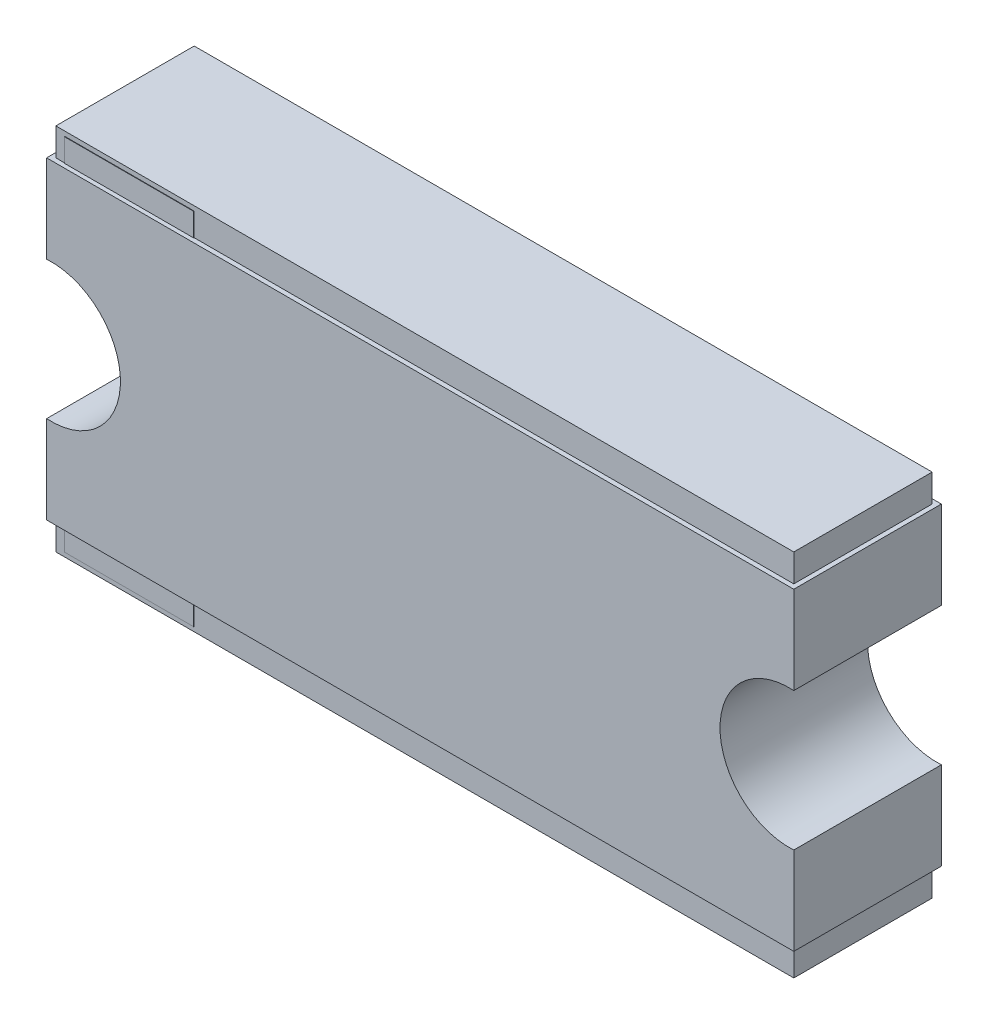
ISO-10303-21;
HEADER;
FILE_DESCRIPTION(('STEP AP214'),'2;1');
FILE_NAME('part.step','',(''),(''),'','','');
FILE_SCHEMA(('AUTOMOTIVE_DESIGN { 1 0 10303 214 1 1 1 1 }'));
ENDSEC;
DATA;
#1=APPLICATION_CONTEXT('core data for automotive mechanical design processes');
#2=APPLICATION_PROTOCOL_DEFINITION('international standard','automotive_design',2000,#1);
#3=PRODUCT_CONTEXT('',#1,'mechanical');
#4=PRODUCT('Part','Part','',(#3));
#5=PRODUCT_RELATED_PRODUCT_CATEGORY('part','',(#4));
#6=PRODUCT_DEFINITION_FORMATION('','',#4);
#7=PRODUCT_DEFINITION_CONTEXT('part definition',#1,'design');
#8=PRODUCT_DEFINITION('design','',#6,#7);
#9=PRODUCT_DEFINITION_SHAPE('','',#8);
#10=(LENGTH_UNIT() NAMED_UNIT(*) SI_UNIT(.MILLI.,.METRE.));
#11=(NAMED_UNIT(*) PLANE_ANGLE_UNIT() SI_UNIT($,.RADIAN.));
#12=(NAMED_UNIT(*) SI_UNIT($,.STERADIAN.) SOLID_ANGLE_UNIT());
#13=UNCERTAINTY_MEASURE_WITH_UNIT(LENGTH_MEASURE(1.E-05),#10,'distance_accuracy_value','');
#14=(GEOMETRIC_REPRESENTATION_CONTEXT(3) GLOBAL_UNCERTAINTY_ASSIGNED_CONTEXT((#13)) GLOBAL_UNIT_ASSIGNED_CONTEXT((#10,
#11,#12)) REPRESENTATION_CONTEXT('',''));
#15=CARTESIAN_POINT('',(0.,0.,0.));
#16=DIRECTION('',(0.,0.,1.));
#17=DIRECTION('',(1.,0.,0.));
#18=AXIS2_PLACEMENT_3D('',#15,#16,#17);
#19=CARTESIAN_POINT('',(0.,0.,0.));
#20=DIRECTION('',(0.,0.,-1.));
#21=DIRECTION('',(-1.,0.,0.));
#22=AXIS2_PLACEMENT_3D('',#19,#20,#21);
#23=PLANE('',#22);
#24=DIRECTION('',(0.,-1.,0.));
#25=VECTOR('',#24,1.);
#26=CARTESIAN_POINT('',(0.475,0.375,0.));
#27=LINE('',#26,#25);
#28=CARTESIAN_POINT('',(0.475,0.375,0.));
#29=VERTEX_POINT('',#28);
#30=CARTESIAN_POINT('',(0.475,-0.375,0.));
#31=VERTEX_POINT('',#30);
#32=EDGE_CURVE('E337',#29,#31,#27,.T.);
#33=ORIENTED_EDGE('',*,*,#32,.T.);
#34=DIRECTION('',(1.,0.,0.));
#35=VECTOR('',#34,1.);
#36=CARTESIAN_POINT('',(0.475,-0.375,0.));
#37=LINE('',#36,#35);
#38=CARTESIAN_POINT('',(-0.475,-0.375,0.));
#39=VERTEX_POINT('',#38);
#40=EDGE_CURVE('E330',#31,#39,#37,.F.);
#41=ORIENTED_EDGE('',*,*,#40,.T.);
#42=DIRECTION('',(0.,1.,0.));
#43=VECTOR('',#42,1.);
#44=CARTESIAN_POINT('',(-0.475,0.375,0.));
#45=LINE('',#44,#43);
#46=CARTESIAN_POINT('',(-0.475,0.375,0.));
#47=VERTEX_POINT('',#46);
#48=EDGE_CURVE('E323',#39,#47,#45,.T.);
#49=ORIENTED_EDGE('',*,*,#48,.T.);
#50=DIRECTION('',(1.,0.,0.));
#51=VECTOR('',#50,1.);
#52=CARTESIAN_POINT('',(0.475,0.375,0.));
#53=LINE('',#52,#51);
#54=EDGE_CURVE('E343',#47,#29,#53,.T.);
#55=ORIENTED_EDGE('',*,*,#54,.T.);
#56=EDGE_LOOP('',(#33,#41,#49,#55));
#57=FACE_BOUND('',#56,.T.);
#58=ADVANCED_FACE('F17',(#57),#23,.T.);
#59=CARTESIAN_POINT('',(0.475,0.375,0.));
#60=DIRECTION('',(0.,-1.,0.));
#61=DIRECTION('',(0.,0.,-1.));
#62=AXIS2_PLACEMENT_3D('',#59,#60,#61);
#63=PLANE('',#62);
#64=DIRECTION('',(0.,0.,1.));
#65=VECTOR('',#64,1.);
#66=CARTESIAN_POINT('',(0.475,0.375,0.));
#67=LINE('',#66,#65);
#68=CARTESIAN_POINT('',(0.475,0.375,0.01));
#69=VERTEX_POINT('',#68);
#70=EDGE_CURVE('E340',#69,#29,#67,.F.);
#71=ORIENTED_EDGE('',*,*,#70,.T.);
#72=ORIENTED_EDGE('',*,*,#54,.F.);
#73=DIRECTION('',(0.,0.,1.));
#74=VECTOR('',#73,1.);
#75=CARTESIAN_POINT('',(-0.475,0.375,0.));
#76=LINE('',#75,#74);
#77=CARTESIAN_POINT('',(-0.475,0.375,0.01));
#78=VERTEX_POINT('',#77);
#79=EDGE_CURVE('E313',#47,#78,#76,.T.);
#80=ORIENTED_EDGE('',*,*,#79,.T.);
#81=DIRECTION('',(1.,0.,0.));
#82=VECTOR('',#81,1.);
#83=CARTESIAN_POINT('',(0.8,0.375,0.01));
#84=LINE('',#83,#82);
#85=EDGE_CURVE('E287',#78,#69,#84,.T.);
#86=ORIENTED_EDGE('',*,*,#85,.T.);
#87=EDGE_LOOP('',(#71,#72,#80,#86));
#88=FACE_BOUND('',#87,.T.);
#89=ADVANCED_FACE('F1043',(#88),#63,.F.);
#90=CARTESIAN_POINT('',(0.475,0.375,0.));
#91=DIRECTION('',(-1.,0.,0.));
#92=DIRECTION('',(0.,-1.,0.));
#93=AXIS2_PLACEMENT_3D('',#90,#91,#92);
#94=PLANE('',#93);
#95=DIRECTION('',(0.,0.,1.));
#96=VECTOR('',#95,1.);
#97=CARTESIAN_POINT('',(0.475,-0.375,0.));
#98=LINE('',#97,#96);
#99=CARTESIAN_POINT('',(0.475,-0.375,0.01));
#100=VERTEX_POINT('',#99);
#101=EDGE_CURVE('E333',#100,#31,#98,.F.);
#102=ORIENTED_EDGE('',*,*,#101,.T.);
#103=ORIENTED_EDGE('',*,*,#32,.F.);
#104=ORIENTED_EDGE('',*,*,#70,.F.);
#105=DIRECTION('',(0.,1.,0.));
#106=VECTOR('',#105,1.);
#107=CARTESIAN_POINT('',(0.475,-0.4,0.01));
#108=LINE('',#107,#106);
#109=EDGE_CURVE('E284',#69,#100,#108,.F.);
#110=ORIENTED_EDGE('',*,*,#109,.T.);
#111=EDGE_LOOP('',(#102,#103,#104,#110));
#112=FACE_BOUND('',#111,.T.);
#113=ADVANCED_FACE('F1033',(#112),#94,.F.);
#114=CARTESIAN_POINT('',(0.475,-0.375,0.));
#115=DIRECTION('',(0.,1.,0.));
#116=DIRECTION('',(0.,0.,1.));
#117=AXIS2_PLACEMENT_3D('',#114,#115,#116);
#118=PLANE('',#117);
#119=DIRECTION('',(0.,0.,1.));
#120=VECTOR('',#119,1.);
#121=CARTESIAN_POINT('',(-0.475,-0.375,0.));
#122=LINE('',#121,#120);
#123=CARTESIAN_POINT('',(-0.475,-0.375,0.01));
#124=VERTEX_POINT('',#123);
#125=EDGE_CURVE('E326',#124,#39,#122,.F.);
#126=ORIENTED_EDGE('',*,*,#125,.T.);
#127=ORIENTED_EDGE('',*,*,#40,.F.);
#128=ORIENTED_EDGE('',*,*,#101,.F.);
#129=DIRECTION('',(1.,0.,0.));
#130=VECTOR('',#129,1.);
#131=CARTESIAN_POINT('',(0.8,-0.375,0.01));
#132=LINE('',#131,#130);
#133=EDGE_CURVE('E281',#100,#124,#132,.F.);
#134=ORIENTED_EDGE('',*,*,#133,.T.);
#135=EDGE_LOOP('',(#126,#127,#128,#134));
#136=FACE_BOUND('',#135,.T.);
#137=ADVANCED_FACE('F1024',(#136),#118,.F.);
#138=CARTESIAN_POINT('',(-0.475,0.375,0.));
#139=DIRECTION('',(1.,0.,0.));
#140=DIRECTION('',(0.,1.,0.));
#141=AXIS2_PLACEMENT_3D('',#138,#139,#140);
#142=PLANE('',#141);
#143=ORIENTED_EDGE('',*,*,#79,.F.);
#144=ORIENTED_EDGE('',*,*,#48,.F.);
#145=ORIENTED_EDGE('',*,*,#125,.F.);
#146=DIRECTION('',(0.,1.,0.));
#147=VECTOR('',#146,1.);
#148=CARTESIAN_POINT('',(-0.475,-0.4,0.01));
#149=LINE('',#148,#147);
#150=EDGE_CURVE('E276',#124,#78,#149,.T.);
#151=ORIENTED_EDGE('',*,*,#150,.T.);
#152=EDGE_LOOP('',(#143,#144,#145,#151));
#153=FACE_BOUND('',#152,.T.);
#154=ADVANCED_FACE('F1014',(#153),#142,.F.);
#155=CARTESIAN_POINT('',(0.8,-0.4,0.01));
#156=DIRECTION('',(0.,0.,1.));
#157=DIRECTION('',(1.,0.,0.));
#158=AXIS2_PLACEMENT_3D('',#155,#156,#157);
#159=PLANE('',#158);
#160=ORIENTED_EDGE('',*,*,#133,.F.);
#161=ORIENTED_EDGE('',*,*,#109,.F.);
#162=ORIENTED_EDGE('',*,*,#85,.F.);
#163=ORIENTED_EDGE('',*,*,#150,.F.);
#164=EDGE_LOOP('',(#160,#161,#162,#163));
#165=FACE_BOUND('',#164,.T.);
#166=DIRECTION('',(1.,0.,0.));
#167=VECTOR('',#166,1.);
#168=CARTESIAN_POINT('',(0.8,-0.34,0.01));
#169=LINE('',#168,#167);
#170=CARTESIAN_POINT('',(-0.5,-0.34,0.01));
#171=VERTEX_POINT('',#170);
#172=CARTESIAN_POINT('',(-0.8,-0.34,0.01));
#173=VERTEX_POINT('',#172);
#174=EDGE_CURVE('E318',#171,#173,#169,.F.);
#175=ORIENTED_EDGE('',*,*,#174,.F.);
#176=DIRECTION('',(0.,1.,0.));
#177=VECTOR('',#176,1.);
#178=CARTESIAN_POINT('',(-0.5,-0.4,0.01));
#179=LINE('',#178,#177);
#180=CARTESIAN_POINT('',(-0.5,0.34,0.01));
#181=VERTEX_POINT('',#180);
#182=EDGE_CURVE('E348',#181,#171,#179,.F.);
#183=ORIENTED_EDGE('',*,*,#182,.F.);
#184=DIRECTION('',(1.,0.,0.));
#185=VECTOR('',#184,1.);
#186=CARTESIAN_POINT('',(0.8,0.34,0.01));
#187=LINE('',#186,#185);
#188=CARTESIAN_POINT('',(-0.8,0.34,0.01));
#189=VERTEX_POINT('',#188);
#190=EDGE_CURVE('E294',#189,#181,#187,.T.);
#191=ORIENTED_EDGE('',*,*,#190,.F.);
#192=DIRECTION('',(0.,1.,0.));
#193=VECTOR('',#192,1.);
#194=CARTESIAN_POINT('',(-0.8,-0.4,0.01));
#195=LINE('',#194,#193);
#196=CARTESIAN_POINT('',(-0.8,0.4,0.01));
#197=VERTEX_POINT('',#196);
#198=EDGE_CURVE('E291',#197,#189,#195,.F.);
#199=ORIENTED_EDGE('',*,*,#198,.F.);
#200=DIRECTION('',(1.,0.,0.));
#201=VECTOR('',#200,1.);
#202=CARTESIAN_POINT('',(-0.8,0.4,0.01));
#203=LINE('',#202,#201);
#204=CARTESIAN_POINT('',(0.8,0.4,0.01));
#205=VERTEX_POINT('',#204);
#206=EDGE_CURVE('E235',#197,#205,#203,.T.);
#207=ORIENTED_EDGE('',*,*,#206,.T.);
#208=DIRECTION('',(0.,1.,0.));
#209=VECTOR('',#208,1.);
#210=CARTESIAN_POINT('',(0.8,-0.4,0.01));
#211=LINE('',#210,#209);
#212=CARTESIAN_POINT('',(0.8,0.34,0.01));
#213=VERTEX_POINT('',#212);
#214=EDGE_CURVE('E295',#213,#205,#211,.T.);
#215=ORIENTED_EDGE('',*,*,#214,.F.);
#216=DIRECTION('',(1.,0.,0.));
#217=VECTOR('',#216,1.);
#218=CARTESIAN_POINT('',(0.8,0.34,0.01));
#219=LINE('',#218,#217);
#220=CARTESIAN_POINT('',(0.5,0.34,0.01));
#221=VERTEX_POINT('',#220);
#222=EDGE_CURVE('E306',#221,#213,#219,.T.);
#223=ORIENTED_EDGE('',*,*,#222,.F.);
#224=DIRECTION('',(0.,1.,0.));
#225=VECTOR('',#224,1.);
#226=CARTESIAN_POINT('',(0.5,-0.4,0.01));
#227=LINE('',#226,#225);
#228=CARTESIAN_POINT('',(0.5,-0.34,0.01));
#229=VERTEX_POINT('',#228);
#230=EDGE_CURVE('E361',#229,#221,#227,.T.);
#231=ORIENTED_EDGE('',*,*,#230,.F.);
#232=DIRECTION('',(1.,0.,0.));
#233=VECTOR('',#232,1.);
#234=CARTESIAN_POINT('',(0.8,-0.34,0.01));
#235=LINE('',#234,#233);
#236=CARTESIAN_POINT('',(0.8,-0.34,0.01));
#237=VERTEX_POINT('',#236);
#238=EDGE_CURVE('E312',#237,#229,#235,.F.);
#239=ORIENTED_EDGE('',*,*,#238,.F.);
#240=DIRECTION('',(0.,1.,0.));
#241=VECTOR('',#240,1.);
#242=CARTESIAN_POINT('',(0.8,-0.4,0.01));
#243=LINE('',#242,#241);
#244=CARTESIAN_POINT('',(0.8,-0.4,0.01));
#245=VERTEX_POINT('',#244);
#246=EDGE_CURVE('E309',#245,#237,#243,.T.);
#247=ORIENTED_EDGE('',*,*,#246,.F.);
#248=DIRECTION('',(1.,0.,0.));
#249=VECTOR('',#248,1.);
#250=CARTESIAN_POINT('',(-0.8,-0.4,0.01));
#251=LINE('',#250,#249);
#252=CARTESIAN_POINT('',(-0.8,-0.4,0.01));
#253=VERTEX_POINT('',#252);
#254=EDGE_CURVE('E271',#245,#253,#251,.F.);
#255=ORIENTED_EDGE('',*,*,#254,.T.);
#256=DIRECTION('',(0.,1.,0.));
#257=VECTOR('',#256,1.);
#258=CARTESIAN_POINT('',(-0.8,-0.4,0.01));
#259=LINE('',#258,#257);
#260=EDGE_CURVE('E290',#173,#253,#259,.F.);
#261=ORIENTED_EDGE('',*,*,#260,.F.);
#262=EDGE_LOOP('',(#175,#183,#191,#199,#207,#215,#223,#231,#239,#247,#255,#261));
#263=FACE_BOUND('',#262,.T.);
#264=ADVANCED_FACE('F644',(#165,#263),#159,.F.);
#265=CARTESIAN_POINT('',(-0.8,-0.4,0.31));
#266=DIRECTION('',(0.,1.,0.));
#267=DIRECTION('',(0.,0.,1.));
#268=AXIS2_PLACEMENT_3D('',#265,#266,#267);
#269=PLANE('',#268);
#270=DIRECTION('',(0.,0.,1.));
#271=VECTOR('',#270,1.);
#272=CARTESIAN_POINT('',(-0.8,-0.4,0.31));
#273=LINE('',#272,#271);
#274=CARTESIAN_POINT('',(-0.8,-0.4,0.31));
#275=VERTEX_POINT('',#274);
#276=EDGE_CURVE('E250',#253,#275,#273,.T.);
#277=ORIENTED_EDGE('',*,*,#276,.F.);
#278=ORIENTED_EDGE('',*,*,#254,.F.);
#279=DIRECTION('',(0.,0.,1.));
#280=VECTOR('',#279,1.);
#281=CARTESIAN_POINT('',(0.8,-0.4,0.));
#282=LINE('',#281,#280);
#283=CARTESIAN_POINT('',(0.8,-0.4,0.31));
#284=VERTEX_POINT('',#283);
#285=EDGE_CURVE('E255',#245,#284,#282,.T.);
#286=ORIENTED_EDGE('',*,*,#285,.T.);
#287=DIRECTION('',(1.,0.,0.));
#288=VECTOR('',#287,1.);
#289=CARTESIAN_POINT('',(0.8,-0.4,0.31));
#290=LINE('',#289,#288);
#291=EDGE_CURVE('E429',#275,#284,#290,.T.);
#292=ORIENTED_EDGE('',*,*,#291,.F.);
#293=EDGE_LOOP('',(#277,#278,#286,#292));
#294=FACE_BOUND('',#293,.T.);
#295=ADVANCED_FACE('F700',(#294),#269,.F.);
#296=CARTESIAN_POINT('',(-0.5,-0.39,0.311));
#297=DIRECTION('',(0.,1.,0.));
#298=DIRECTION('',(0.,0.,1.));
#299=AXIS2_PLACEMENT_3D('',#296,#297,#298);
#300=PLANE('',#299);
#301=DIRECTION('',(0.,0.,1.));
#302=VECTOR('',#301,1.);
#303=CARTESIAN_POINT('',(-0.5,-0.39,0.311));
#304=LINE('',#303,#302);
#305=CARTESIAN_POINT('',(-0.5,-0.39,0.31));
#306=VERTEX_POINT('',#305);
#307=CARTESIAN_POINT('',(-0.5,-0.39,0.311));
#308=VERTEX_POINT('',#307);
#309=EDGE_CURVE('E230',#306,#308,#304,.T.);
#310=ORIENTED_EDGE('',*,*,#309,.T.);
#311=DIRECTION('',(-1.,0.,0.));
#312=VECTOR('',#311,1.);
#313=CARTESIAN_POINT('',(0.,-0.39,0.311));
#314=LINE('',#313,#312);
#315=CARTESIAN_POINT('',(-0.78,-0.39,0.311));
#316=VERTEX_POINT('',#315);
#317=EDGE_CURVE('E224',#308,#316,#314,.T.);
#318=ORIENTED_EDGE('',*,*,#317,.T.);
#319=DIRECTION('',(0.,0.,1.));
#320=VECTOR('',#319,1.);
#321=CARTESIAN_POINT('',(-0.78,-0.39,0.311));
#322=LINE('',#321,#320);
#323=CARTESIAN_POINT('',(-0.78,-0.39,0.31));
#324=VERTEX_POINT('',#323);
#325=EDGE_CURVE('E20',#316,#324,#322,.F.);
#326=ORIENTED_EDGE('',*,*,#325,.T.);
#327=DIRECTION('',(1.,0.,0.));
#328=VECTOR('',#327,1.);
#329=CARTESIAN_POINT('',(0.8,-0.39,0.31));
#330=LINE('',#329,#328);
#331=EDGE_CURVE('E263',#306,#324,#330,.F.);
#332=ORIENTED_EDGE('',*,*,#331,.F.);
#333=EDGE_LOOP('',(#310,#318,#326,#332));
#334=FACE_BOUND('',#333,.T.);
#335=ADVANCED_FACE('F226',(#334),#300,.F.);
#336=CARTESIAN_POINT('',(-0.8,0.4,0.31));
#337=DIRECTION('',(0.,-1.,0.));
#338=DIRECTION('',(0.,0.,-1.));
#339=AXIS2_PLACEMENT_3D('',#336,#337,#338);
#340=PLANE('',#339);
#341=DIRECTION('',(0.,0.,-1.));
#342=VECTOR('',#341,1.);
#343=CARTESIAN_POINT('',(-0.8,0.4,0.31));
#344=LINE('',#343,#342);
#345=CARTESIAN_POINT('',(-0.8,0.4,0.31));
#346=VERTEX_POINT('',#345);
#347=EDGE_CURVE('E301',#346,#197,#344,.T.);
#348=ORIENTED_EDGE('',*,*,#347,.F.);
#349=DIRECTION('',(1.,0.,0.));
#350=VECTOR('',#349,1.);
#351=CARTESIAN_POINT('',(0.8,0.4,0.31));
#352=LINE('',#351,#350);
#353=CARTESIAN_POINT('',(0.8,0.4,0.31));
#354=VERTEX_POINT('',#353);
#355=EDGE_CURVE('E496',#354,#346,#352,.F.);
#356=ORIENTED_EDGE('',*,*,#355,.F.);
#357=DIRECTION('',(0.,0.,-1.));
#358=VECTOR('',#357,1.);
#359=CARTESIAN_POINT('',(0.8,0.4,0.31));
#360=LINE('',#359,#358);
#361=EDGE_CURVE('E275',#205,#354,#360,.F.);
#362=ORIENTED_EDGE('',*,*,#361,.F.);
#363=ORIENTED_EDGE('',*,*,#206,.F.);
#364=EDGE_LOOP('',(#348,#356,#362,#363));
#365=FACE_BOUND('',#364,.T.);
#366=ADVANCED_FACE('F979',(#365),#340,.F.);
#367=CARTESIAN_POINT('',(-0.78,0.39,0.311));
#368=DIRECTION('',(0.,-1.,0.));
#369=DIRECTION('',(0.,0.,-1.));
#370=AXIS2_PLACEMENT_3D('',#367,#368,#369);
#371=PLANE('',#370);
#372=DIRECTION('',(0.,0.,-1.));
#373=VECTOR('',#372,1.);
#374=CARTESIAN_POINT('',(-0.78,0.39,0.311));
#375=LINE('',#374,#373);
#376=CARTESIAN_POINT('',(-0.78,0.39,0.31));
#377=VERTEX_POINT('',#376);
#378=CARTESIAN_POINT('',(-0.78,0.39,0.311));
#379=VERTEX_POINT('',#378);
#380=EDGE_CURVE('E416',#377,#379,#375,.F.);
#381=ORIENTED_EDGE('',*,*,#380,.T.);
#382=DIRECTION('',(-1.,0.,0.));
#383=VECTOR('',#382,1.);
#384=CARTESIAN_POINT('',(0.,0.39,0.311));
#385=LINE('',#384,#383);
#386=CARTESIAN_POINT('',(-0.5,0.39,0.311));
#387=VERTEX_POINT('',#386);
#388=EDGE_CURVE('E497',#379,#387,#385,.F.);
#389=ORIENTED_EDGE('',*,*,#388,.T.);
#390=DIRECTION('',(0.,0.,-1.));
#391=VECTOR('',#390,1.);
#392=CARTESIAN_POINT('',(-0.5,0.39,0.311));
#393=LINE('',#392,#391);
#394=CARTESIAN_POINT('',(-0.5,0.39,0.31));
#395=VERTEX_POINT('',#394);
#396=EDGE_CURVE('E411',#387,#395,#393,.T.);
#397=ORIENTED_EDGE('',*,*,#396,.T.);
#398=DIRECTION('',(1.,0.,0.));
#399=VECTOR('',#398,1.);
#400=CARTESIAN_POINT('',(0.8,0.39,0.31));
#401=LINE('',#400,#399);
#402=EDGE_CURVE('E492',#377,#395,#401,.T.);
#403=ORIENTED_EDGE('',*,*,#402,.F.);
#404=EDGE_LOOP('',(#381,#389,#397,#403));
#405=FACE_BOUND('',#404,.T.);
#406=ADVANCED_FACE('F970',(#405),#371,.F.);
#407=CARTESIAN_POINT('',(0.,0.,0.311));
#408=DIRECTION('',(0.,0.,-1.));
#409=DIRECTION('',(-1.,0.,0.));
#410=AXIS2_PLACEMENT_3D('',#407,#408,#409);
#411=PLANE('',#410);
#412=DIRECTION('',(0.,1.,0.));
#413=VECTOR('',#412,1.);
#414=CARTESIAN_POINT('',(-0.5,-0.34,0.311));
#415=LINE('',#414,#413);
#416=CARTESIAN_POINT('',(-0.5,-0.34,0.311));
#417=VERTEX_POINT('',#416);
#418=EDGE_CURVE('E421',#308,#417,#415,.T.);
#419=ORIENTED_EDGE('',*,*,#418,.T.);
#420=DIRECTION('',(1.,0.,0.));
#421=VECTOR('',#420,1.);
#422=CARTESIAN_POINT('',(-0.81,-0.34,0.311));
#423=LINE('',#422,#421);
#424=CARTESIAN_POINT('',(-0.78,-0.34,0.311));
#425=VERTEX_POINT('',#424);
#426=EDGE_CURVE('E240',#417,#425,#423,.F.);
#427=ORIENTED_EDGE('',*,*,#426,.T.);
#428=DIRECTION('',(0.,1.,0.));
#429=VECTOR('',#428,1.);
#430=CARTESIAN_POINT('',(-0.78,-0.39,0.311));
#431=LINE('',#430,#429);
#432=EDGE_CURVE('E234',#425,#316,#431,.F.);
#433=ORIENTED_EDGE('',*,*,#432,.T.);
#434=ORIENTED_EDGE('',*,*,#317,.F.);
#435=EDGE_LOOP('',(#419,#427,#433,#434));
#436=FACE_BOUND('',#435,.T.);
#437=ADVANCED_FACE('F238',(#436),#411,.F.);
#438=CARTESIAN_POINT('',(-0.78,-0.39,0.311));
#439=DIRECTION('',(1.,0.,0.));
#440=DIRECTION('',(0.,1.,0.));
#441=AXIS2_PLACEMENT_3D('',#438,#439,#440);
#442=PLANE('',#441);
#443=ORIENTED_EDGE('',*,*,#325,.F.);
#444=ORIENTED_EDGE('',*,*,#432,.F.);
#445=DIRECTION('',(0.,0.,1.));
#446=VECTOR('',#445,1.);
#447=CARTESIAN_POINT('',(-0.78,-0.34,0.311));
#448=LINE('',#447,#446);
#449=CARTESIAN_POINT('',(-0.78,-0.34,0.31));
#450=VERTEX_POINT('',#449);
#451=EDGE_CURVE('E402',#425,#450,#448,.F.);
#452=ORIENTED_EDGE('',*,*,#451,.T.);
#453=DIRECTION('',(0.,1.,0.));
#454=VECTOR('',#453,1.);
#455=CARTESIAN_POINT('',(-0.78,-0.4,0.31));
#456=LINE('',#455,#454);
#457=EDGE_CURVE('E247',#324,#450,#456,.T.);
#458=ORIENTED_EDGE('',*,*,#457,.F.);
#459=EDGE_LOOP('',(#443,#444,#452,#458));
#460=FACE_BOUND('',#459,.T.);
#461=ADVANCED_FACE('F245',(#460),#442,.F.);
#462=CARTESIAN_POINT('',(-0.8,-0.4,0.31));
#463=DIRECTION('',(-1.,0.,0.));
#464=DIRECTION('',(0.,-1.,0.));
#465=AXIS2_PLACEMENT_3D('',#462,#463,#464);
#466=PLANE('',#465);
#467=ORIENTED_EDGE('',*,*,#276,.T.);
#468=DIRECTION('',(0.,1.,0.));
#469=VECTOR('',#468,1.);
#470=CARTESIAN_POINT('',(-0.8,-0.4,0.31));
#471=LINE('',#470,#469);
#472=CARTESIAN_POINT('',(-0.8,-0.34,0.31));
#473=VERTEX_POINT('',#472);
#474=EDGE_CURVE('E438',#473,#275,#471,.F.);
#475=ORIENTED_EDGE('',*,*,#474,.F.);
#476=DIRECTION('',(0.,0.,1.));
#477=VECTOR('',#476,1.);
#478=CARTESIAN_POINT('',(-0.8,-0.34,0.32));
#479=LINE('',#478,#477);
#480=EDGE_CURVE('E471',#473,#173,#479,.F.);
#481=ORIENTED_EDGE('',*,*,#480,.T.);
#482=ORIENTED_EDGE('',*,*,#260,.T.);
#483=EDGE_LOOP('',(#467,#475,#481,#482));
#484=FACE_BOUND('',#483,.T.);
#485=ADVANCED_FACE('F695',(#484),#466,.T.);
#486=CARTESIAN_POINT('',(0.8,0.,0.));
#487=DIRECTION('',(-1.,0.,0.));
#488=DIRECTION('',(0.,0.,1.));
#489=AXIS2_PLACEMENT_3D('',#486,#487,#488);
#490=PLANE('',#489);
#491=ORIENTED_EDGE('',*,*,#246,.T.);
#492=DIRECTION('',(0.,0.,1.));
#493=VECTOR('',#492,1.);
#494=CARTESIAN_POINT('',(0.8,-0.34,0.32));
#495=LINE('',#494,#493);
#496=CARTESIAN_POINT('',(0.8,-0.34,0.31));
#497=VERTEX_POINT('',#496);
#498=EDGE_CURVE('E443',#237,#497,#495,.T.);
#499=ORIENTED_EDGE('',*,*,#498,.T.);
#500=DIRECTION('',(0.,1.,0.));
#501=VECTOR('',#500,1.);
#502=CARTESIAN_POINT('',(0.8,-0.4,0.31));
#503=LINE('',#502,#501);
#504=EDGE_CURVE('E422',#284,#497,#503,.T.);
#505=ORIENTED_EDGE('',*,*,#504,.F.);
#506=ORIENTED_EDGE('',*,*,#285,.F.);
#507=EDGE_LOOP('',(#491,#499,#505,#506));
#508=FACE_BOUND('',#507,.T.);
#509=ADVANCED_FACE('F702',(#508),#490,.F.);
#510=CARTESIAN_POINT('',(0.8,-0.4,0.31));
#511=DIRECTION('',(0.,0.,1.));
#512=DIRECTION('',(1.,0.,0.));
#513=AXIS2_PLACEMENT_3D('',#510,#511,#512);
#514=PLANE('',#513);
#515=ORIENTED_EDGE('',*,*,#291,.T.);
#516=ORIENTED_EDGE('',*,*,#504,.T.);
#517=DIRECTION('',(1.,0.,0.));
#518=VECTOR('',#517,1.);
#519=CARTESIAN_POINT('',(-0.81,-0.34,0.31));
#520=LINE('',#519,#518);
#521=CARTESIAN_POINT('',(-0.5,-0.34,0.31));
#522=VERTEX_POINT('',#521);
#523=EDGE_CURVE('E401',#497,#522,#520,.F.);
#524=ORIENTED_EDGE('',*,*,#523,.T.);
#525=DIRECTION('',(0.,1.,0.));
#526=VECTOR('',#525,1.);
#527=CARTESIAN_POINT('',(-0.5,-0.34,0.31));
#528=LINE('',#527,#526);
#529=EDGE_CURVE('E425',#522,#306,#528,.F.);
#530=ORIENTED_EDGE('',*,*,#529,.T.);
#531=ORIENTED_EDGE('',*,*,#331,.T.);
#532=ORIENTED_EDGE('',*,*,#457,.T.);
#533=DIRECTION('',(1.,0.,0.));
#534=VECTOR('',#533,1.);
#535=CARTESIAN_POINT('',(-0.81,-0.34,0.31));
#536=LINE('',#535,#534);
#537=EDGE_CURVE('E405',#450,#473,#536,.F.);
#538=ORIENTED_EDGE('',*,*,#537,.T.);
#539=ORIENTED_EDGE('',*,*,#474,.T.);
#540=EDGE_LOOP('',(#515,#516,#524,#530,#531,#532,#538,#539));
#541=FACE_BOUND('',#540,.T.);
#542=ADVANCED_FACE('F540',(#541),#514,.T.);
#543=CARTESIAN_POINT('',(-0.5,-0.34,0.311));
#544=DIRECTION('',(-1.,0.,0.));
#545=DIRECTION('',(0.,0.,1.));
#546=AXIS2_PLACEMENT_3D('',#543,#544,#545);
#547=PLANE('',#546);
#548=DIRECTION('',(0.,0.,1.));
#549=VECTOR('',#548,1.);
#550=CARTESIAN_POINT('',(-0.5,-0.34,0.311));
#551=LINE('',#550,#549);
#552=EDGE_CURVE('E396',#522,#417,#551,.T.);
#553=ORIENTED_EDGE('',*,*,#552,.T.);
#554=ORIENTED_EDGE('',*,*,#418,.F.);
#555=ORIENTED_EDGE('',*,*,#309,.F.);
#556=ORIENTED_EDGE('',*,*,#529,.F.);
#557=EDGE_LOOP('',(#553,#554,#555,#556));
#558=FACE_BOUND('',#557,.T.);
#559=ADVANCED_FACE('F547',(#558),#547,.F.);
#560=CARTESIAN_POINT('',(0.8,-0.4,0.31));
#561=DIRECTION('',(0.,0.,1.));
#562=DIRECTION('',(1.,0.,0.));
#563=AXIS2_PLACEMENT_3D('',#560,#561,#562);
#564=PLANE('',#563);
#565=DIRECTION('',(1.,0.,0.));
#566=VECTOR('',#565,1.);
#567=CARTESIAN_POINT('',(0.8,0.34,0.31));
#568=LINE('',#567,#566);
#569=CARTESIAN_POINT('',(-0.8,0.34,0.31));
#570=VERTEX_POINT('',#569);
#571=CARTESIAN_POINT('',(-0.78,0.34,0.31));
#572=VERTEX_POINT('',#571);
#573=EDGE_CURVE('E501',#570,#572,#568,.T.);
#574=ORIENTED_EDGE('',*,*,#573,.T.);
#575=DIRECTION('',(0.,1.,0.));
#576=VECTOR('',#575,1.);
#577=CARTESIAN_POINT('',(-0.78,0.34,0.31));
#578=LINE('',#577,#576);
#579=EDGE_CURVE('E418',#572,#377,#578,.T.);
#580=ORIENTED_EDGE('',*,*,#579,.T.);
#581=ORIENTED_EDGE('',*,*,#402,.T.);
#582=DIRECTION('',(0.,1.,0.));
#583=VECTOR('',#582,1.);
#584=CARTESIAN_POINT('',(-0.5,0.39,0.31));
#585=LINE('',#584,#583);
#586=CARTESIAN_POINT('',(-0.5,0.34,0.31));
#587=VERTEX_POINT('',#586);
#588=EDGE_CURVE('E414',#395,#587,#585,.F.);
#589=ORIENTED_EDGE('',*,*,#588,.T.);
#590=DIRECTION('',(1.,0.,0.));
#591=VECTOR('',#590,1.);
#592=CARTESIAN_POINT('',(-0.81,0.34,0.31));
#593=LINE('',#592,#591);
#594=CARTESIAN_POINT('',(0.8,0.34,0.31));
#595=VERTEX_POINT('',#594);
#596=EDGE_CURVE('E615',#587,#595,#593,.T.);
#597=ORIENTED_EDGE('',*,*,#596,.T.);
#598=DIRECTION('',(0.,1.,0.));
#599=VECTOR('',#598,1.);
#600=CARTESIAN_POINT('',(0.8,0.,0.31));
#601=LINE('',#600,#599);
#602=EDGE_CURVE('E504',#595,#354,#601,.T.);
#603=ORIENTED_EDGE('',*,*,#602,.T.);
#604=ORIENTED_EDGE('',*,*,#355,.T.);
#605=DIRECTION('',(0.,-1.,0.));
#606=VECTOR('',#605,1.);
#607=CARTESIAN_POINT('',(-0.8,-0.4,0.31));
#608=LINE('',#607,#606);
#609=EDGE_CURVE('E419',#570,#346,#608,.F.);
#610=ORIENTED_EDGE('',*,*,#609,.F.);
#611=EDGE_LOOP('',(#574,#580,#581,#589,#597,#603,#604,#610));
#612=FACE_BOUND('',#611,.T.);
#613=ADVANCED_FACE('F657',(#612),#564,.T.);
#614=CARTESIAN_POINT('',(0.8,0.,0.));
#615=DIRECTION('',(-1.,0.,0.));
#616=DIRECTION('',(0.,0.,1.));
#617=AXIS2_PLACEMENT_3D('',#614,#615,#616);
#618=PLANE('',#617);
#619=ORIENTED_EDGE('',*,*,#602,.F.);
#620=DIRECTION('',(0.,0.,-1.));
#621=VECTOR('',#620,1.);
#622=CARTESIAN_POINT('',(0.8,0.34,0.32));
#623=LINE('',#622,#621);
#624=EDGE_CURVE('E604',#595,#213,#623,.T.);
#625=ORIENTED_EDGE('',*,*,#624,.T.);
#626=ORIENTED_EDGE('',*,*,#214,.T.);
#627=ORIENTED_EDGE('',*,*,#361,.T.);
#628=EDGE_LOOP('',(#619,#625,#626,#627));
#629=FACE_BOUND('',#628,.T.);
#630=ADVANCED_FACE('F653',(#629),#618,.F.);
#631=CARTESIAN_POINT('',(0.5,0.,0.));
#632=DIRECTION('',(1.,0.,0.));
#633=DIRECTION('',(0.,0.,-1.));
#634=AXIS2_PLACEMENT_3D('',#631,#632,#633);
#635=PLANE('',#634);
#636=DIRECTION('',(0.,1.,0.));
#637=VECTOR('',#636,1.);
#638=CARTESIAN_POINT('',(0.5,-0.34,0.));
#639=LINE('',#638,#637);
#640=CARTESIAN_POINT('',(0.5,0.34,0.));
#641=VERTEX_POINT('',#640);
#642=CARTESIAN_POINT('',(0.5,-0.34,0.));
#643=VERTEX_POINT('',#642);
#644=EDGE_CURVE('E478',#641,#643,#639,.F.);
#645=ORIENTED_EDGE('',*,*,#644,.T.);
#646=DIRECTION('',(0.,0.,1.));
#647=VECTOR('',#646,1.);
#648=CARTESIAN_POINT('',(0.5,-0.34,0.32));
#649=LINE('',#648,#647);
#650=EDGE_CURVE('E446',#643,#229,#649,.T.);
#651=ORIENTED_EDGE('',*,*,#650,.T.);
#652=ORIENTED_EDGE('',*,*,#230,.T.);
#653=DIRECTION('',(0.,0.,-1.));
#654=VECTOR('',#653,1.);
#655=CARTESIAN_POINT('',(0.5,0.34,0.32));
#656=LINE('',#655,#654);
#657=EDGE_CURVE('E596',#221,#641,#656,.T.);
#658=ORIENTED_EDGE('',*,*,#657,.T.);
#659=EDGE_LOOP('',(#645,#651,#652,#658));
#660=FACE_BOUND('',#659,.T.);
#661=ADVANCED_FACE('F639',(#660),#635,.F.);
#662=CARTESIAN_POINT('',(0.5,-0.34,0.));
#663=DIRECTION('',(0.,0.,1.));
#664=DIRECTION('',(1.,0.,0.));
#665=AXIS2_PLACEMENT_3D('',#662,#663,#664);
#666=PLANE('',#665);
#667=CARTESIAN_POINT('',(0.8,0.,0.));
#668=DIRECTION('',(0.,0.,-1.));
#669=DIRECTION('',(-1.,0.,0.));
#670=AXIS2_PLACEMENT_3D('',#667,#668,#669);
#671=CIRCLE('',#670,0.149999999999987);
#672=CARTESIAN_POINT('',(0.81,0.149666295470945,0.));
#673=VERTEX_POINT('',#672);
#674=CARTESIAN_POINT('',(0.81,-0.149666295470945,0.));
#675=VERTEX_POINT('',#674);
#676=EDGE_CURVE('E391',#673,#675,#671,.F.);
#677=ORIENTED_EDGE('',*,*,#676,.T.);
#678=DIRECTION('',(0.,1.,0.));
#679=VECTOR('',#678,1.);
#680=CARTESIAN_POINT('',(0.81,0.,0.));
#681=LINE('',#680,#679);
#682=CARTESIAN_POINT('',(0.81,-0.34,0.));
#683=VERTEX_POINT('',#682);
#684=EDGE_CURVE('E618',#675,#683,#681,.F.);
#685=ORIENTED_EDGE('',*,*,#684,.T.);
#686=DIRECTION('',(1.,0.,0.));
#687=VECTOR('',#686,1.);
#688=CARTESIAN_POINT('',(-0.81,-0.34,0.));
#689=LINE('',#688,#687);
#690=EDGE_CURVE('E452',#683,#643,#689,.F.);
#691=ORIENTED_EDGE('',*,*,#690,.T.);
#692=ORIENTED_EDGE('',*,*,#644,.F.);
#693=DIRECTION('',(1.,0.,0.));
#694=VECTOR('',#693,1.);
#695=CARTESIAN_POINT('',(-0.81,0.34,0.));
#696=LINE('',#695,#694);
#697=CARTESIAN_POINT('',(0.81,0.34,0.));
#698=VERTEX_POINT('',#697);
#699=EDGE_CURVE('E594',#641,#698,#696,.T.);
#700=ORIENTED_EDGE('',*,*,#699,.T.);
#701=DIRECTION('',(0.,1.,0.));
#702=VECTOR('',#701,1.);
#703=CARTESIAN_POINT('',(0.81,0.,0.));
#704=LINE('',#703,#702);
#705=EDGE_CURVE('E394',#698,#673,#704,.F.);
#706=ORIENTED_EDGE('',*,*,#705,.T.);
#707=EDGE_LOOP('',(#677,#685,#691,#692,#700,#706));
#708=FACE_BOUND('',#707,.T.);
#709=ADVANCED_FACE('F631',(#708),#666,.F.);
#710=CARTESIAN_POINT('',(0.5,-0.34,0.));
#711=DIRECTION('',(0.,0.,1.));
#712=DIRECTION('',(1.,0.,0.));
#713=AXIS2_PLACEMENT_3D('',#710,#711,#712);
#714=PLANE('',#713);
#715=DIRECTION('',(0.,1.,0.));
#716=VECTOR('',#715,1.);
#717=CARTESIAN_POINT('',(-0.81,0.,0.));
#718=LINE('',#717,#716);
#719=CARTESIAN_POINT('',(-0.81,0.149666295470945,0.));
#720=VERTEX_POINT('',#719);
#721=CARTESIAN_POINT('',(-0.81,0.34,0.));
#722=VERTEX_POINT('',#721);
#723=EDGE_CURVE('E410',#720,#722,#718,.T.);
#724=ORIENTED_EDGE('',*,*,#723,.T.);
#725=DIRECTION('',(1.,0.,0.));
#726=VECTOR('',#725,1.);
#727=CARTESIAN_POINT('',(-0.81,0.34,0.));
#728=LINE('',#727,#726);
#729=CARTESIAN_POINT('',(-0.5,0.34,0.));
#730=VERTEX_POINT('',#729);
#731=EDGE_CURVE('E511',#722,#730,#728,.T.);
#732=ORIENTED_EDGE('',*,*,#731,.T.);
#733=DIRECTION('',(0.,1.,0.));
#734=VECTOR('',#733,1.);
#735=CARTESIAN_POINT('',(-0.5,0.,0.));
#736=LINE('',#735,#734);
#737=CARTESIAN_POINT('',(-0.5,-0.34,0.));
#738=VERTEX_POINT('',#737);
#739=EDGE_CURVE('E474',#738,#730,#736,.T.);
#740=ORIENTED_EDGE('',*,*,#739,.F.);
#741=DIRECTION('',(1.,0.,0.));
#742=VECTOR('',#741,1.);
#743=CARTESIAN_POINT('',(-0.81,-0.34,0.));
#744=LINE('',#743,#742);
#745=CARTESIAN_POINT('',(-0.81,-0.34,0.));
#746=VERTEX_POINT('',#745);
#747=EDGE_CURVE('E461',#738,#746,#744,.F.);
#748=ORIENTED_EDGE('',*,*,#747,.T.);
#749=DIRECTION('',(0.,1.,0.));
#750=VECTOR('',#749,1.);
#751=CARTESIAN_POINT('',(-0.81,0.,0.));
#752=LINE('',#751,#750);
#753=CARTESIAN_POINT('',(-0.81,-0.149666295470945,0.));
#754=VERTEX_POINT('',#753);
#755=EDGE_CURVE('E455',#746,#754,#752,.T.);
#756=ORIENTED_EDGE('',*,*,#755,.T.);
#757=CARTESIAN_POINT('',(-0.8,0.,0.));
#758=DIRECTION('',(0.,0.,-1.));
#759=DIRECTION('',(-1.,0.,0.));
#760=AXIS2_PLACEMENT_3D('',#757,#758,#759);
#761=CIRCLE('',#760,0.149999999999987);
#762=EDGE_CURVE('E406',#754,#720,#761,.F.);
#763=ORIENTED_EDGE('',*,*,#762,.T.);
#764=EDGE_LOOP('',(#724,#732,#740,#748,#756,#763));
#765=FACE_BOUND('',#764,.T.);
#766=ADVANCED_FACE('F766',(#765),#714,.F.);
#767=CARTESIAN_POINT('',(-0.5,0.,0.));
#768=DIRECTION('',(1.,0.,0.));
#769=DIRECTION('',(0.,0.,-1.));
#770=AXIS2_PLACEMENT_3D('',#767,#768,#769);
#771=PLANE('',#770);
#772=DIRECTION('',(0.,0.,1.));
#773=VECTOR('',#772,1.);
#774=CARTESIAN_POINT('',(-0.5,-0.34,0.32));
#775=LINE('',#774,#773);
#776=EDGE_CURVE('E465',#171,#738,#775,.F.);
#777=ORIENTED_EDGE('',*,*,#776,.T.);
#778=ORIENTED_EDGE('',*,*,#739,.T.);
#779=DIRECTION('',(0.,0.,-1.));
#780=VECTOR('',#779,1.);
#781=CARTESIAN_POINT('',(-0.5,0.34,0.32));
#782=LINE('',#781,#780);
#783=EDGE_CURVE('E507',#730,#181,#782,.F.);
#784=ORIENTED_EDGE('',*,*,#783,.T.);
#785=ORIENTED_EDGE('',*,*,#182,.T.);
#786=EDGE_LOOP('',(#777,#778,#784,#785));
#787=FACE_BOUND('',#786,.T.);
#788=ADVANCED_FACE('F762',(#787),#771,.T.);
#789=CARTESIAN_POINT('',(-0.8,-0.4,0.31));
#790=DIRECTION('',(-1.,0.,0.));
#791=DIRECTION('',(0.,-1.,0.));
#792=AXIS2_PLACEMENT_3D('',#789,#790,#791);
#793=PLANE('',#792);
#794=ORIENTED_EDGE('',*,*,#609,.T.);
#795=ORIENTED_EDGE('',*,*,#347,.T.);
#796=ORIENTED_EDGE('',*,*,#198,.T.);
#797=DIRECTION('',(0.,0.,-1.));
#798=VECTOR('',#797,1.);
#799=CARTESIAN_POINT('',(-0.8,0.34,0.32));
#800=LINE('',#799,#798);
#801=EDGE_CURVE('E390',#189,#570,#800,.F.);
#802=ORIENTED_EDGE('',*,*,#801,.T.);
#803=EDGE_LOOP('',(#794,#795,#796,#802));
#804=FACE_BOUND('',#803,.T.);
#805=ADVANCED_FACE('F758',(#804),#793,.T.);
#806=CARTESIAN_POINT('',(-0.78,0.34,0.311));
#807=DIRECTION('',(1.,0.,0.));
#808=DIRECTION('',(0.,0.,-1.));
#809=AXIS2_PLACEMENT_3D('',#806,#807,#808);
#810=PLANE('',#809);
#811=DIRECTION('',(0.,0.,-1.));
#812=VECTOR('',#811,1.);
#813=CARTESIAN_POINT('',(-0.78,0.34,0.311));
#814=LINE('',#813,#812);
#815=CARTESIAN_POINT('',(-0.78,0.34,0.311));
#816=VERTEX_POINT('',#815);
#817=EDGE_CURVE('E387',#572,#816,#814,.F.);
#818=ORIENTED_EDGE('',*,*,#817,.T.);
#819=DIRECTION('',(0.,1.,0.));
#820=VECTOR('',#819,1.);
#821=CARTESIAN_POINT('',(-0.78,0.,0.311));
#822=LINE('',#821,#820);
#823=EDGE_CURVE('E500',#816,#379,#822,.T.);
#824=ORIENTED_EDGE('',*,*,#823,.T.);
#825=ORIENTED_EDGE('',*,*,#380,.F.);
#826=ORIENTED_EDGE('',*,*,#579,.F.);
#827=EDGE_LOOP('',(#818,#824,#825,#826));
#828=FACE_BOUND('',#827,.T.);
#829=ADVANCED_FACE('F754',(#828),#810,.F.);
#830=CARTESIAN_POINT('',(0.,0.,0.311));
#831=DIRECTION('',(0.,0.,-1.));
#832=DIRECTION('',(-1.,0.,0.));
#833=AXIS2_PLACEMENT_3D('',#830,#831,#832);
#834=PLANE('',#833);
#835=DIRECTION('',(0.,1.,0.));
#836=VECTOR('',#835,1.);
#837=CARTESIAN_POINT('',(-0.5,0.39,0.311));
#838=LINE('',#837,#836);
#839=CARTESIAN_POINT('',(-0.5,0.34,0.311));
#840=VERTEX_POINT('',#839);
#841=EDGE_CURVE('E415',#840,#387,#838,.T.);
#842=ORIENTED_EDGE('',*,*,#841,.T.);
#843=ORIENTED_EDGE('',*,*,#388,.F.);
#844=ORIENTED_EDGE('',*,*,#823,.F.);
#845=DIRECTION('',(1.,0.,0.));
#846=VECTOR('',#845,1.);
#847=CARTESIAN_POINT('',(-0.81,0.34,0.311));
#848=LINE('',#847,#846);
#849=EDGE_CURVE('E386',#816,#840,#848,.T.);
#850=ORIENTED_EDGE('',*,*,#849,.T.);
#851=EDGE_LOOP('',(#842,#843,#844,#850));
#852=FACE_BOUND('',#851,.T.);
#853=ADVANCED_FACE('F750',(#852),#834,.F.);
#854=CARTESIAN_POINT('',(-0.5,0.39,0.311));
#855=DIRECTION('',(-1.,0.,0.));
#856=DIRECTION('',(0.,0.,1.));
#857=AXIS2_PLACEMENT_3D('',#854,#855,#856);
#858=PLANE('',#857);
#859=ORIENTED_EDGE('',*,*,#396,.F.);
#860=ORIENTED_EDGE('',*,*,#841,.F.);
#861=DIRECTION('',(0.,0.,1.));
#862=VECTOR('',#861,1.);
#863=CARTESIAN_POINT('',(-0.5,0.34,0.311));
#864=LINE('',#863,#862);
#865=EDGE_CURVE('E382',#840,#587,#864,.F.);
#866=ORIENTED_EDGE('',*,*,#865,.T.);
#867=ORIENTED_EDGE('',*,*,#588,.F.);
#868=EDGE_LOOP('',(#859,#860,#866,#867));
#869=FACE_BOUND('',#868,.T.);
#870=ADVANCED_FACE('F746',(#869),#858,.F.);
#871=CARTESIAN_POINT('',(-0.81,0.,0.));
#872=DIRECTION('',(1.,0.,0.));
#873=DIRECTION('',(0.,1.,0.));
#874=AXIS2_PLACEMENT_3D('',#871,#872,#873);
#875=PLANE('',#874);
#876=DIRECTION('',(0.,0.,-1.));
#877=VECTOR('',#876,1.);
#878=CARTESIAN_POINT('',(-0.81,0.149666295470945,0.));
#879=LINE('',#878,#877);
#880=CARTESIAN_POINT('',(-0.81,0.149666295470945,0.32));
#881=VERTEX_POINT('',#880);
#882=EDGE_CURVE('E409',#720,#881,#879,.F.);
#883=ORIENTED_EDGE('',*,*,#882,.T.);
#884=DIRECTION('',(0.,1.,0.));
#885=VECTOR('',#884,1.);
#886=CARTESIAN_POINT('',(-0.81,-0.34,0.32));
#887=LINE('',#886,#885);
#888=CARTESIAN_POINT('',(-0.81,0.34,0.32));
#889=VERTEX_POINT('',#888);
#890=EDGE_CURVE('E381',#889,#881,#887,.F.);
#891=ORIENTED_EDGE('',*,*,#890,.F.);
#892=DIRECTION('',(0.,0.,-1.));
#893=VECTOR('',#892,1.);
#894=CARTESIAN_POINT('',(-0.81,0.34,0.32));
#895=LINE('',#894,#893);
#896=EDGE_CURVE('E565',#889,#722,#895,.T.);
#897=ORIENTED_EDGE('',*,*,#896,.T.);
#898=ORIENTED_EDGE('',*,*,#723,.F.);
#899=EDGE_LOOP('',(#883,#891,#897,#898));
#900=FACE_BOUND('',#899,.T.);
#901=ADVANCED_FACE('F742',(#900),#875,.F.);
#902=CARTESIAN_POINT('',(-0.8,0.,0.));
#903=DIRECTION('',(0.,0.,-1.));
#904=DIRECTION('',(-1.,0.,0.));
#905=AXIS2_PLACEMENT_3D('',#902,#903,#904);
#906=CYLINDRICAL_SURFACE('',#905,0.149999999999987);
#907=ORIENTED_EDGE('',*,*,#882,.F.);
#908=ORIENTED_EDGE('',*,*,#762,.F.);
#909=DIRECTION('',(0.,0.,1.));
#910=VECTOR('',#909,1.);
#911=CARTESIAN_POINT('',(-0.81,-0.149666295470945,0.));
#912=LINE('',#911,#910);
#913=CARTESIAN_POINT('',(-0.81,-0.149666295470945,0.32));
#914=VERTEX_POINT('',#913);
#915=EDGE_CURVE('E458',#754,#914,#912,.T.);
#916=ORIENTED_EDGE('',*,*,#915,.T.);
#917=CARTESIAN_POINT('',(-0.8,0.,0.32));
#918=DIRECTION('',(0.,0.,-1.));
#919=DIRECTION('',(-1.,0.,0.));
#920=AXIS2_PLACEMENT_3D('',#917,#918,#919);
#921=CIRCLE('',#920,0.149999999999987);
#922=EDGE_CURVE('E376',#881,#914,#921,.T.);
#923=ORIENTED_EDGE('',*,*,#922,.F.);
#924=EDGE_LOOP('',(#907,#908,#916,#923));
#925=FACE_BOUND('',#924,.T.);
#926=ADVANCED_FACE('F738',(#925),#906,.F.);
#927=CARTESIAN_POINT('',(-0.81,0.,0.));
#928=DIRECTION('',(1.,0.,0.));
#929=DIRECTION('',(0.,1.,0.));
#930=AXIS2_PLACEMENT_3D('',#927,#928,#929);
#931=PLANE('',#930);
#932=ORIENTED_EDGE('',*,*,#915,.F.);
#933=ORIENTED_EDGE('',*,*,#755,.F.);
#934=DIRECTION('',(0.,0.,1.));
#935=VECTOR('',#934,1.);
#936=CARTESIAN_POINT('',(-0.81,-0.34,0.32));
#937=LINE('',#936,#935);
#938=CARTESIAN_POINT('',(-0.81,-0.34,0.32));
#939=VERTEX_POINT('',#938);
#940=EDGE_CURVE('E464',#746,#939,#937,.T.);
#941=ORIENTED_EDGE('',*,*,#940,.T.);
#942=DIRECTION('',(0.,1.,0.));
#943=VECTOR('',#942,1.);
#944=CARTESIAN_POINT('',(-0.81,-0.34,0.32));
#945=LINE('',#944,#943);
#946=EDGE_CURVE('E380',#914,#939,#945,.F.);
#947=ORIENTED_EDGE('',*,*,#946,.F.);
#948=EDGE_LOOP('',(#932,#933,#941,#947));
#949=FACE_BOUND('',#948,.T.);
#950=ADVANCED_FACE('F735',(#949),#931,.F.);
#951=CARTESIAN_POINT('',(-0.81,-0.34,0.32));
#952=DIRECTION('',(0.,1.,0.));
#953=DIRECTION('',(0.,0.,1.));
#954=AXIS2_PLACEMENT_3D('',#951,#952,#953);
#955=PLANE('',#954);
#956=ORIENTED_EDGE('',*,*,#523,.F.);
#957=ORIENTED_EDGE('',*,*,#498,.F.);
#958=ORIENTED_EDGE('',*,*,#238,.T.);
#959=ORIENTED_EDGE('',*,*,#650,.F.);
#960=ORIENTED_EDGE('',*,*,#690,.F.);
#961=DIRECTION('',(0.,0.,1.));
#962=VECTOR('',#961,1.);
#963=CARTESIAN_POINT('',(0.81,-0.34,0.));
#964=LINE('',#963,#962);
#965=CARTESIAN_POINT('',(0.81,-0.34,0.32));
#966=VERTEX_POINT('',#965);
#967=EDGE_CURVE('E400',#683,#966,#964,.T.);
#968=ORIENTED_EDGE('',*,*,#967,.T.);
#969=DIRECTION('',(1.,0.,0.));
#970=VECTOR('',#969,1.);
#971=CARTESIAN_POINT('',(-0.81,-0.34,0.32));
#972=LINE('',#971,#970);
#973=EDGE_CURVE('E683',#939,#966,#972,.T.);
#974=ORIENTED_EDGE('',*,*,#973,.F.);
#975=ORIENTED_EDGE('',*,*,#940,.F.);
#976=ORIENTED_EDGE('',*,*,#747,.F.);
#977=ORIENTED_EDGE('',*,*,#776,.F.);
#978=ORIENTED_EDGE('',*,*,#174,.T.);
#979=ORIENTED_EDGE('',*,*,#480,.F.);
#980=ORIENTED_EDGE('',*,*,#537,.F.);
#981=ORIENTED_EDGE('',*,*,#451,.F.);
#982=ORIENTED_EDGE('',*,*,#426,.F.);
#983=ORIENTED_EDGE('',*,*,#552,.F.);
#984=EDGE_LOOP('',(#956,#957,#958,#959,#960,#968,#974,#975,#976,#977,#978,#979,#980,#981,#982,#983));
#985=FACE_BOUND('',#984,.T.);
#986=ADVANCED_FACE('F549',(#985),#955,.F.);
#987=CARTESIAN_POINT('',(0.81,0.,0.));
#988=DIRECTION('',(-1.,0.,0.));
#989=DIRECTION('',(0.,0.,1.));
#990=AXIS2_PLACEMENT_3D('',#987,#988,#989);
#991=PLANE('',#990);
#992=DIRECTION('',(0.,0.,-1.));
#993=VECTOR('',#992,1.);
#994=CARTESIAN_POINT('',(0.81,-0.149666295470945,0.));
#995=LINE('',#994,#993);
#996=CARTESIAN_POINT('',(0.81,-0.149666295470945,0.32));
#997=VERTEX_POINT('',#996);
#998=EDGE_CURVE('E395',#675,#997,#995,.F.);
#999=ORIENTED_EDGE('',*,*,#998,.T.);
#1000=DIRECTION('',(0.,1.,0.));
#1001=VECTOR('',#1000,1.);
#1002=CARTESIAN_POINT('',(0.81,-0.34,0.32));
#1003=LINE('',#1002,#1001);
#1004=EDGE_CURVE('E375',#966,#997,#1003,.T.);
#1005=ORIENTED_EDGE('',*,*,#1004,.F.);
#1006=ORIENTED_EDGE('',*,*,#967,.F.);
#1007=ORIENTED_EDGE('',*,*,#684,.F.);
#1008=EDGE_LOOP('',(#999,#1005,#1006,#1007));
#1009=FACE_BOUND('',#1008,.T.);
#1010=ADVANCED_FACE('F728',(#1009),#991,.F.);
#1011=CARTESIAN_POINT('',(0.8,0.,0.));
#1012=DIRECTION('',(0.,0.,-1.));
#1013=DIRECTION('',(-1.,0.,0.));
#1014=AXIS2_PLACEMENT_3D('',#1011,#1012,#1013);
#1015=CYLINDRICAL_SURFACE('',#1014,0.149999999999987);
#1016=DIRECTION('',(0.,0.,1.));
#1017=VECTOR('',#1016,1.);
#1018=CARTESIAN_POINT('',(0.81,0.149666295470945,0.));
#1019=LINE('',#1018,#1017);
#1020=CARTESIAN_POINT('',(0.81,0.149666295470945,0.32));
#1021=VERTEX_POINT('',#1020);
#1022=EDGE_CURVE('E591',#673,#1021,#1019,.T.);
#1023=ORIENTED_EDGE('',*,*,#1022,.T.);
#1024=CARTESIAN_POINT('',(0.8,0.,0.32));
#1025=DIRECTION('',(0.,0.,-1.));
#1026=DIRECTION('',(-1.,0.,0.));
#1027=AXIS2_PLACEMENT_3D('',#1024,#1025,#1026);
#1028=CIRCLE('',#1027,0.149999999999987);
#1029=EDGE_CURVE('E372',#997,#1021,#1028,.T.);
#1030=ORIENTED_EDGE('',*,*,#1029,.F.);
#1031=ORIENTED_EDGE('',*,*,#998,.F.);
#1032=ORIENTED_EDGE('',*,*,#676,.F.);
#1033=EDGE_LOOP('',(#1023,#1030,#1031,#1032));
#1034=FACE_BOUND('',#1033,.T.);
#1035=ADVANCED_FACE('F725',(#1034),#1015,.F.);
#1036=CARTESIAN_POINT('',(0.81,0.,0.));
#1037=DIRECTION('',(-1.,0.,0.));
#1038=DIRECTION('',(0.,0.,1.));
#1039=AXIS2_PLACEMENT_3D('',#1036,#1037,#1038);
#1040=PLANE('',#1039);
#1041=ORIENTED_EDGE('',*,*,#1022,.F.);
#1042=ORIENTED_EDGE('',*,*,#705,.F.);
#1043=DIRECTION('',(0.,0.,-1.));
#1044=VECTOR('',#1043,1.);
#1045=CARTESIAN_POINT('',(0.81,0.34,0.32));
#1046=LINE('',#1045,#1044);
#1047=CARTESIAN_POINT('',(0.81,0.34,0.32));
#1048=VERTEX_POINT('',#1047);
#1049=EDGE_CURVE('E36',#698,#1048,#1046,.F.);
#1050=ORIENTED_EDGE('',*,*,#1049,.T.);
#1051=DIRECTION('',(0.,1.,0.));
#1052=VECTOR('',#1051,1.);
#1053=CARTESIAN_POINT('',(0.81,-0.34,0.32));
#1054=LINE('',#1053,#1052);
#1055=EDGE_CURVE('E27',#1021,#1048,#1054,.T.);
#1056=ORIENTED_EDGE('',*,*,#1055,.F.);
#1057=EDGE_LOOP('',(#1041,#1042,#1050,#1056));
#1058=FACE_BOUND('',#1057,.T.);
#1059=ADVANCED_FACE('F719',(#1058),#1040,.F.);
#1060=CARTESIAN_POINT('',(-0.81,0.34,0.32));
#1061=DIRECTION('',(0.,-1.,0.));
#1062=DIRECTION('',(0.,0.,-1.));
#1063=AXIS2_PLACEMENT_3D('',#1060,#1061,#1062);
#1064=PLANE('',#1063);
#1065=ORIENTED_EDGE('',*,*,#849,.F.);
#1066=ORIENTED_EDGE('',*,*,#817,.F.);
#1067=ORIENTED_EDGE('',*,*,#573,.F.);
#1068=ORIENTED_EDGE('',*,*,#801,.F.);
#1069=ORIENTED_EDGE('',*,*,#190,.T.);
#1070=ORIENTED_EDGE('',*,*,#783,.F.);
#1071=ORIENTED_EDGE('',*,*,#731,.F.);
#1072=ORIENTED_EDGE('',*,*,#896,.F.);
#1073=DIRECTION('',(1.,0.,0.));
#1074=VECTOR('',#1073,1.);
#1075=CARTESIAN_POINT('',(-0.81,0.34,0.32));
#1076=LINE('',#1075,#1074);
#1077=EDGE_CURVE('E11',#1048,#889,#1076,.F.);
#1078=ORIENTED_EDGE('',*,*,#1077,.F.);
#1079=ORIENTED_EDGE('',*,*,#1049,.F.);
#1080=ORIENTED_EDGE('',*,*,#699,.F.);
#1081=ORIENTED_EDGE('',*,*,#657,.F.);
#1082=ORIENTED_EDGE('',*,*,#222,.T.);
#1083=ORIENTED_EDGE('',*,*,#624,.F.);
#1084=ORIENTED_EDGE('',*,*,#596,.F.);
#1085=ORIENTED_EDGE('',*,*,#865,.F.);
#1086=EDGE_LOOP('',(#1065,#1066,#1067,#1068,#1069,#1070,#1071,#1072,#1078,#1079,#1080,#1081,
#1082,#1083,#1084,#1085));
#1087=FACE_BOUND('',#1086,.T.);
#1088=ADVANCED_FACE('F649',(#1087),#1064,.F.);
#1089=CARTESIAN_POINT('',(-0.81,-0.34,0.32));
#1090=DIRECTION('',(0.,0.,1.));
#1091=DIRECTION('',(1.,0.,0.));
#1092=AXIS2_PLACEMENT_3D('',#1089,#1090,#1091);
#1093=PLANE('',#1092);
#1094=ORIENTED_EDGE('',*,*,#1055,.T.);
#1095=ORIENTED_EDGE('',*,*,#1077,.T.);
#1096=ORIENTED_EDGE('',*,*,#890,.T.);
#1097=ORIENTED_EDGE('',*,*,#922,.T.);
#1098=ORIENTED_EDGE('',*,*,#946,.T.);
#1099=ORIENTED_EDGE('',*,*,#973,.T.);
#1100=ORIENTED_EDGE('',*,*,#1004,.T.);
#1101=ORIENTED_EDGE('',*,*,#1029,.T.);
#1102=EDGE_LOOP('',(#1094,#1095,#1096,#1097,#1098,#1099,#1100,#1101));
#1103=FACE_BOUND('',#1102,.T.);
#1104=ADVANCED_FACE('F712',(#1103),#1093,.T.);
#1105=CLOSED_SHELL('',(#58,#89,#113,#137,#154,#264,#295,#335,#366,#406,#437,#461,#485,#509,#542,
#559,#613,#630,#661,#709,#766,#788,#805,#829,#853,#870,#901,#926,#950,#986,#1010,#1035,#1059,
#1088,#1104));
#1106=MANIFOLD_SOLID_BREP('B1',#1105);
#1107=ADVANCED_BREP_SHAPE_REPRESENTATION('',(#18,#1106),#14);
#1108=SHAPE_DEFINITION_REPRESENTATION(#9,#1107);
ENDSEC;
END-ISO-10303-21;
